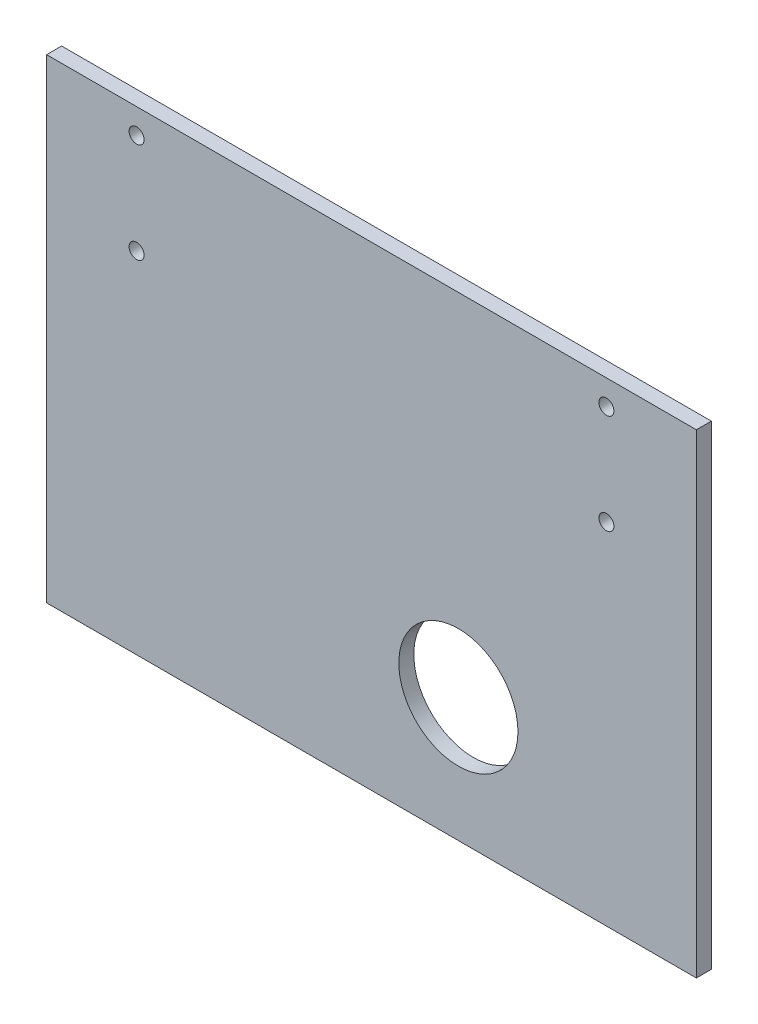
ISO-10303-21;
HEADER;
FILE_DESCRIPTION(('STEP AP214'),'2;1');
FILE_NAME('part.step','',(''),(''),'','','');
FILE_SCHEMA(('AUTOMOTIVE_DESIGN { 1 0 10303 214 1 1 1 1 }'));
ENDSEC;
DATA;
#1=APPLICATION_CONTEXT('core data for automotive mechanical design processes');
#2=APPLICATION_PROTOCOL_DEFINITION('international standard','automotive_design',2000,#1);
#3=PRODUCT_CONTEXT('',#1,'mechanical');
#4=PRODUCT('Part','Part','',(#3));
#5=PRODUCT_RELATED_PRODUCT_CATEGORY('part','',(#4));
#6=PRODUCT_DEFINITION_FORMATION('','',#4);
#7=PRODUCT_DEFINITION_CONTEXT('part definition',#1,'design');
#8=PRODUCT_DEFINITION('design','',#6,#7);
#9=PRODUCT_DEFINITION_SHAPE('','',#8);
#10=(LENGTH_UNIT() NAMED_UNIT(*) SI_UNIT(.MILLI.,.METRE.));
#11=(NAMED_UNIT(*) PLANE_ANGLE_UNIT() SI_UNIT($,.RADIAN.));
#12=(NAMED_UNIT(*) SI_UNIT($,.STERADIAN.) SOLID_ANGLE_UNIT());
#13=UNCERTAINTY_MEASURE_WITH_UNIT(LENGTH_MEASURE(1.E-05),#10,'distance_accuracy_value','');
#14=(GEOMETRIC_REPRESENTATION_CONTEXT(3) GLOBAL_UNCERTAINTY_ASSIGNED_CONTEXT((#13)) GLOBAL_UNIT_ASSIGNED_CONTEXT((#10,
#11,#12)) REPRESENTATION_CONTEXT('',''));
#15=CARTESIAN_POINT('',(0.,0.,0.));
#16=DIRECTION('',(0.,0.,1.));
#17=DIRECTION('',(1.,0.,0.));
#18=AXIS2_PLACEMENT_3D('',#15,#16,#17);
#19=CARTESIAN_POINT('',(-65.,-47.5,3.));
#20=DIRECTION('',(1.,0.,0.));
#21=DIRECTION('',(0.,0.,-1.));
#22=AXIS2_PLACEMENT_3D('',#19,#20,#21);
#23=PLANE('',#22);
#24=DIRECTION('',(0.,-1.,0.));
#25=VECTOR('',#24,1.);
#26=CARTESIAN_POINT('',(-65.,-47.5,0.));
#27=LINE('',#26,#25);
#28=CARTESIAN_POINT('',(-65.,47.5,0.));
#29=VERTEX_POINT('',#28);
#30=CARTESIAN_POINT('',(-65.,-47.5,0.));
#31=VERTEX_POINT('',#30);
#32=EDGE_CURVE('E109',#29,#31,#27,.T.);
#33=ORIENTED_EDGE('',*,*,#32,.T.);
#34=DIRECTION('',(0.,0.,-1.));
#35=VECTOR('',#34,1.);
#36=CARTESIAN_POINT('',(-65.,-47.5,3.));
#37=LINE('',#36,#35);
#38=CARTESIAN_POINT('',(-65.,-47.5,3.));
#39=VERTEX_POINT('',#38);
#40=EDGE_CURVE('E11',#39,#31,#37,.T.);
#41=ORIENTED_EDGE('',*,*,#40,.F.);
#42=DIRECTION('',(0.,-1.,0.));
#43=VECTOR('',#42,1.);
#44=CARTESIAN_POINT('',(-65.,-47.5,3.));
#45=LINE('',#44,#43);
#46=CARTESIAN_POINT('',(-65.,47.5,3.));
#47=VERTEX_POINT('',#46);
#48=EDGE_CURVE('E96',#47,#39,#45,.T.);
#49=ORIENTED_EDGE('',*,*,#48,.F.);
#50=DIRECTION('',(0.,0.,-1.));
#51=VECTOR('',#50,1.);
#52=CARTESIAN_POINT('',(-65.,47.5,3.));
#53=LINE('',#52,#51);
#54=EDGE_CURVE('E105',#47,#29,#53,.T.);
#55=ORIENTED_EDGE('',*,*,#54,.T.);
#56=EDGE_LOOP('',(#33,#41,#49,#55));
#57=FACE_BOUND('',#56,.T.);
#58=ADVANCED_FACE('F43',(#57),#23,.F.);
#59=CARTESIAN_POINT('',(65.,-47.5,3.));
#60=DIRECTION('',(0.,1.,0.));
#61=DIRECTION('',(-1.,0.,0.));
#62=AXIS2_PLACEMENT_3D('',#59,#60,#61);
#63=PLANE('',#62);
#64=DIRECTION('',(1.,0.,0.));
#65=VECTOR('',#64,1.);
#66=CARTESIAN_POINT('',(65.,-47.5,0.));
#67=LINE('',#66,#65);
#68=CARTESIAN_POINT('',(65.,-47.5,0.));
#69=VERTEX_POINT('',#68);
#70=EDGE_CURVE('E100',#31,#69,#67,.T.);
#71=ORIENTED_EDGE('',*,*,#70,.T.);
#72=DIRECTION('',(0.,0.,-1.));
#73=VECTOR('',#72,1.);
#74=CARTESIAN_POINT('',(65.,-47.5,3.));
#75=LINE('',#74,#73);
#76=CARTESIAN_POINT('',(65.,-47.5,3.));
#77=VERTEX_POINT('',#76);
#78=EDGE_CURVE('E52',#77,#69,#75,.T.);
#79=ORIENTED_EDGE('',*,*,#78,.F.);
#80=DIRECTION('',(1.,0.,0.));
#81=VECTOR('',#80,1.);
#82=CARTESIAN_POINT('',(65.,-47.5,3.));
#83=LINE('',#82,#81);
#84=EDGE_CURVE('E91',#39,#77,#83,.T.);
#85=ORIENTED_EDGE('',*,*,#84,.F.);
#86=ORIENTED_EDGE('',*,*,#40,.T.);
#87=EDGE_LOOP('',(#71,#79,#85,#86));
#88=FACE_BOUND('',#87,.T.);
#89=ADVANCED_FACE('F99',(#88),#63,.F.);
#90=CARTESIAN_POINT('',(65.,-47.5,3.));
#91=DIRECTION('',(-1.,0.,0.));
#92=DIRECTION('',(0.,0.,1.));
#93=AXIS2_PLACEMENT_3D('',#90,#91,#92);
#94=PLANE('',#93);
#95=DIRECTION('',(0.,1.,0.));
#96=VECTOR('',#95,1.);
#97=CARTESIAN_POINT('',(65.,-47.5,0.));
#98=LINE('',#97,#96);
#99=CARTESIAN_POINT('',(65.,47.5,0.));
#100=VERTEX_POINT('',#99);
#101=EDGE_CURVE('E78',#69,#100,#98,.T.);
#102=ORIENTED_EDGE('',*,*,#101,.T.);
#103=DIRECTION('',(0.,0.,-1.));
#104=VECTOR('',#103,1.);
#105=CARTESIAN_POINT('',(65.,47.5,3.));
#106=LINE('',#105,#104);
#107=CARTESIAN_POINT('',(65.,47.5,3.));
#108=VERTEX_POINT('',#107);
#109=EDGE_CURVE('E101',#108,#100,#106,.T.);
#110=ORIENTED_EDGE('',*,*,#109,.F.);
#111=DIRECTION('',(0.,1.,0.));
#112=VECTOR('',#111,1.);
#113=CARTESIAN_POINT('',(65.,-47.5,3.));
#114=LINE('',#113,#112);
#115=EDGE_CURVE('E94',#77,#108,#114,.T.);
#116=ORIENTED_EDGE('',*,*,#115,.F.);
#117=ORIENTED_EDGE('',*,*,#78,.T.);
#118=EDGE_LOOP('',(#102,#110,#116,#117));
#119=FACE_BOUND('',#118,.T.);
#120=ADVANCED_FACE('F103',(#119),#94,.F.);
#121=CARTESIAN_POINT('',(65.,47.5,3.));
#122=DIRECTION('',(0.,-1.,0.));
#123=DIRECTION('',(1.,0.,0.));
#124=AXIS2_PLACEMENT_3D('',#121,#122,#123);
#125=PLANE('',#124);
#126=DIRECTION('',(-1.,0.,0.));
#127=VECTOR('',#126,1.);
#128=CARTESIAN_POINT('',(65.,47.5,0.));
#129=LINE('',#128,#127);
#130=EDGE_CURVE('E84',#100,#29,#129,.T.);
#131=ORIENTED_EDGE('',*,*,#130,.T.);
#132=ORIENTED_EDGE('',*,*,#54,.F.);
#133=DIRECTION('',(-1.,0.,0.));
#134=VECTOR('',#133,1.);
#135=CARTESIAN_POINT('',(65.,47.5,3.));
#136=LINE('',#135,#134);
#137=EDGE_CURVE('E61',#108,#47,#136,.T.);
#138=ORIENTED_EDGE('',*,*,#137,.F.);
#139=ORIENTED_EDGE('',*,*,#109,.T.);
#140=EDGE_LOOP('',(#131,#132,#138,#139));
#141=FACE_BOUND('',#140,.T.);
#142=ADVANCED_FACE('F166',(#141),#125,.F.);
#143=CARTESIAN_POINT('',(0.,0.,3.));
#144=DIRECTION('',(0.,0.,1.));
#145=DIRECTION('',(1.,0.,0.));
#146=AXIS2_PLACEMENT_3D('',#143,#144,#145);
#147=PLANE('',#146);
#148=CARTESIAN_POINT('',(-47.,22.5,3.));
#149=DIRECTION('',(0.,0.,1.));
#150=DIRECTION('',(1.,0.,0.));
#151=AXIS2_PLACEMENT_3D('',#148,#149,#150);
#152=CIRCLE('',#151,1.5);
#153=CARTESIAN_POINT('',(-45.5,22.5,3.));
#154=VERTEX_POINT('',#153);
#155=EDGE_CURVE('E276',#154,#154,#152,.T.);
#156=ORIENTED_EDGE('',*,*,#155,.F.);
#157=EDGE_LOOP('',(#156));
#158=FACE_BOUND('',#157,.T.);
#159=CARTESIAN_POINT('',(47.,42.5,3.));
#160=DIRECTION('',(0.,0.,1.));
#161=DIRECTION('',(1.,0.,0.));
#162=AXIS2_PLACEMENT_3D('',#159,#160,#161);
#163=CIRCLE('',#162,1.5);
#164=CARTESIAN_POINT('',(48.5,42.5,3.));
#165=VERTEX_POINT('',#164);
#166=EDGE_CURVE('E272',#165,#165,#163,.T.);
#167=ORIENTED_EDGE('',*,*,#166,.F.);
#168=EDGE_LOOP('',(#167));
#169=FACE_BOUND('',#168,.T.);
#170=CARTESIAN_POINT('',(47.,22.5,3.));
#171=DIRECTION('',(0.,0.,1.));
#172=DIRECTION('',(1.,0.,0.));
#173=AXIS2_PLACEMENT_3D('',#170,#171,#172);
#174=CIRCLE('',#173,1.5);
#175=CARTESIAN_POINT('',(48.5,22.5,3.));
#176=VERTEX_POINT('',#175);
#177=EDGE_CURVE('E262',#176,#176,#174,.T.);
#178=ORIENTED_EDGE('',*,*,#177,.F.);
#179=EDGE_LOOP('',(#178));
#180=FACE_BOUND('',#179,.T.);
#181=CARTESIAN_POINT('',(17.3826805844137,-22.6773787888463,3.));
#182=DIRECTION('',(0.,0.,1.));
#183=DIRECTION('',(1.,0.,0.));
#184=AXIS2_PLACEMENT_3D('',#181,#182,#183);
#185=CIRCLE('',#184,11.922228353555);
#186=CARTESIAN_POINT('',(29.3049089379688,-22.6773787888463,3.));
#187=VERTEX_POINT('',#186);
#188=EDGE_CURVE('E273',#187,#187,#185,.T.);
#189=ORIENTED_EDGE('',*,*,#188,.F.);
#190=EDGE_LOOP('',(#189));
#191=FACE_BOUND('',#190,.T.);
#192=CARTESIAN_POINT('',(-47.,42.5,3.));
#193=DIRECTION('',(0.,0.,1.));
#194=DIRECTION('',(1.,0.,0.));
#195=AXIS2_PLACEMENT_3D('',#192,#193,#194);
#196=CIRCLE('',#195,1.5);
#197=CARTESIAN_POINT('',(-45.5,42.5,3.));
#198=VERTEX_POINT('',#197);
#199=EDGE_CURVE('E121',#198,#198,#196,.T.);
#200=ORIENTED_EDGE('',*,*,#199,.F.);
#201=EDGE_LOOP('',(#200));
#202=FACE_BOUND('',#201,.T.);
#203=ORIENTED_EDGE('',*,*,#48,.T.);
#204=ORIENTED_EDGE('',*,*,#84,.T.);
#205=ORIENTED_EDGE('',*,*,#115,.T.);
#206=ORIENTED_EDGE('',*,*,#137,.T.);
#207=EDGE_LOOP('',(#203,#204,#205,#206));
#208=FACE_BOUND('',#207,.T.);
#209=ADVANCED_FACE('F92',(#158,#169,#180,#191,#202,#208),#147,.T.);
#210=CARTESIAN_POINT('',(0.,0.,0.));
#211=DIRECTION('',(0.,0.,1.));
#212=DIRECTION('',(1.,0.,0.));
#213=AXIS2_PLACEMENT_3D('',#210,#211,#212);
#214=PLANE('',#213);
#215=CARTESIAN_POINT('',(-47.,22.5,0.));
#216=DIRECTION('',(0.,0.,1.));
#217=DIRECTION('',(1.,0.,0.));
#218=AXIS2_PLACEMENT_3D('',#215,#216,#217);
#219=CIRCLE('',#218,1.5);
#220=CARTESIAN_POINT('',(-45.5,22.5,0.));
#221=VERTEX_POINT('',#220);
#222=EDGE_CURVE('E46',#221,#221,#219,.T.);
#223=ORIENTED_EDGE('',*,*,#222,.T.);
#224=EDGE_LOOP('',(#223));
#225=FACE_BOUND('',#224,.T.);
#226=CARTESIAN_POINT('',(47.,42.5,0.));
#227=DIRECTION('',(0.,0.,1.));
#228=DIRECTION('',(1.,0.,0.));
#229=AXIS2_PLACEMENT_3D('',#226,#227,#228);
#230=CIRCLE('',#229,1.5);
#231=CARTESIAN_POINT('',(48.5,42.5,0.));
#232=VERTEX_POINT('',#231);
#233=EDGE_CURVE('E126',#232,#232,#230,.T.);
#234=ORIENTED_EDGE('',*,*,#233,.T.);
#235=EDGE_LOOP('',(#234));
#236=FACE_BOUND('',#235,.T.);
#237=CARTESIAN_POINT('',(47.,22.5,0.));
#238=DIRECTION('',(0.,0.,1.));
#239=DIRECTION('',(1.,0.,0.));
#240=AXIS2_PLACEMENT_3D('',#237,#238,#239);
#241=CIRCLE('',#240,1.5);
#242=CARTESIAN_POINT('',(48.5,22.5,0.));
#243=VERTEX_POINT('',#242);
#244=EDGE_CURVE('E124',#243,#243,#241,.T.);
#245=ORIENTED_EDGE('',*,*,#244,.T.);
#246=EDGE_LOOP('',(#245));
#247=FACE_BOUND('',#246,.T.);
#248=CARTESIAN_POINT('',(17.3826805844137,-22.6773787888463,0.));
#249=DIRECTION('',(0.,0.,1.));
#250=DIRECTION('',(1.,0.,0.));
#251=AXIS2_PLACEMENT_3D('',#248,#249,#250);
#252=CIRCLE('',#251,11.922228353555);
#253=CARTESIAN_POINT('',(29.3049089379688,-22.6773787888463,0.));
#254=VERTEX_POINT('',#253);
#255=EDGE_CURVE('E120',#254,#254,#252,.T.);
#256=ORIENTED_EDGE('',*,*,#255,.T.);
#257=EDGE_LOOP('',(#256));
#258=FACE_BOUND('',#257,.T.);
#259=CARTESIAN_POINT('',(-47.,42.5,0.));
#260=DIRECTION('',(0.,0.,1.));
#261=DIRECTION('',(1.,0.,0.));
#262=AXIS2_PLACEMENT_3D('',#259,#260,#261);
#263=CIRCLE('',#262,1.5);
#264=CARTESIAN_POINT('',(-45.5,42.5,0.));
#265=VERTEX_POINT('',#264);
#266=EDGE_CURVE('E117',#265,#265,#263,.T.);
#267=ORIENTED_EDGE('',*,*,#266,.T.);
#268=EDGE_LOOP('',(#267));
#269=FACE_BOUND('',#268,.T.);
#270=ORIENTED_EDGE('',*,*,#32,.F.);
#271=ORIENTED_EDGE('',*,*,#130,.F.);
#272=ORIENTED_EDGE('',*,*,#101,.F.);
#273=ORIENTED_EDGE('',*,*,#70,.F.);
#274=EDGE_LOOP('',(#270,#271,#272,#273));
#275=FACE_BOUND('',#274,.T.);
#276=ADVANCED_FACE('F133',(#225,#236,#247,#258,#269,#275),#214,.F.);
#277=CARTESIAN_POINT('',(-47.,42.5,-1.));
#278=DIRECTION('',(0.,0.,1.));
#279=DIRECTION('',(1.,0.,0.));
#280=AXIS2_PLACEMENT_3D('',#277,#278,#279);
#281=CYLINDRICAL_SURFACE('',#280,1.5);
#282=ORIENTED_EDGE('',*,*,#199,.T.);
#283=EDGE_LOOP('',(#282));
#284=FACE_BOUND('',#283,.T.);
#285=ORIENTED_EDGE('',*,*,#266,.F.);
#286=EDGE_LOOP('',(#285));
#287=FACE_BOUND('',#286,.T.);
#288=ADVANCED_FACE('F156',(#284,#287),#281,.F.);
#289=CARTESIAN_POINT('',(17.3826805844137,-22.6773787888463,-1.));
#290=DIRECTION('',(0.,0.,1.));
#291=DIRECTION('',(1.,0.,0.));
#292=AXIS2_PLACEMENT_3D('',#289,#290,#291);
#293=CYLINDRICAL_SURFACE('',#292,11.922228353555);
#294=ORIENTED_EDGE('',*,*,#188,.T.);
#295=EDGE_LOOP('',(#294));
#296=FACE_BOUND('',#295,.T.);
#297=ORIENTED_EDGE('',*,*,#255,.F.);
#298=EDGE_LOOP('',(#297));
#299=FACE_BOUND('',#298,.T.);
#300=ADVANCED_FACE('F163',(#296,#299),#293,.F.);
#301=CARTESIAN_POINT('',(47.,22.5,-1.));
#302=DIRECTION('',(0.,0.,1.));
#303=DIRECTION('',(1.,0.,0.));
#304=AXIS2_PLACEMENT_3D('',#301,#302,#303);
#305=CYLINDRICAL_SURFACE('',#304,1.5);
#306=ORIENTED_EDGE('',*,*,#177,.T.);
#307=EDGE_LOOP('',(#306));
#308=FACE_BOUND('',#307,.T.);
#309=ORIENTED_EDGE('',*,*,#244,.F.);
#310=EDGE_LOOP('',(#309));
#311=FACE_BOUND('',#310,.T.);
#312=ADVANCED_FACE('F143',(#308,#311),#305,.F.);
#313=CARTESIAN_POINT('',(47.,42.5,-1.));
#314=DIRECTION('',(0.,0.,1.));
#315=DIRECTION('',(1.,0.,0.));
#316=AXIS2_PLACEMENT_3D('',#313,#314,#315);
#317=CYLINDRICAL_SURFACE('',#316,1.5);
#318=ORIENTED_EDGE('',*,*,#166,.T.);
#319=EDGE_LOOP('',(#318));
#320=FACE_BOUND('',#319,.T.);
#321=ORIENTED_EDGE('',*,*,#233,.F.);
#322=EDGE_LOOP('',(#321));
#323=FACE_BOUND('',#322,.T.);
#324=ADVANCED_FACE('F137',(#320,#323),#317,.F.);
#325=CARTESIAN_POINT('',(-47.,22.5,-1.));
#326=DIRECTION('',(0.,0.,1.));
#327=DIRECTION('',(1.,0.,0.));
#328=AXIS2_PLACEMENT_3D('',#325,#326,#327);
#329=CYLINDRICAL_SURFACE('',#328,1.5);
#330=ORIENTED_EDGE('',*,*,#155,.T.);
#331=EDGE_LOOP('',(#330));
#332=FACE_BOUND('',#331,.T.);
#333=ORIENTED_EDGE('',*,*,#222,.F.);
#334=EDGE_LOOP('',(#333));
#335=FACE_BOUND('',#334,.T.);
#336=ADVANCED_FACE('F135',(#332,#335),#329,.F.);
#337=CLOSED_SHELL('',(#58,#89,#120,#142,#209,#276,#288,#300,#312,#324,#336));
#338=MANIFOLD_SOLID_BREP('B2',#337);
#339=ADVANCED_BREP_SHAPE_REPRESENTATION('',(#18,#338),#14);
#340=SHAPE_DEFINITION_REPRESENTATION(#9,#339);
ENDSEC;
END-ISO-10303-21;
